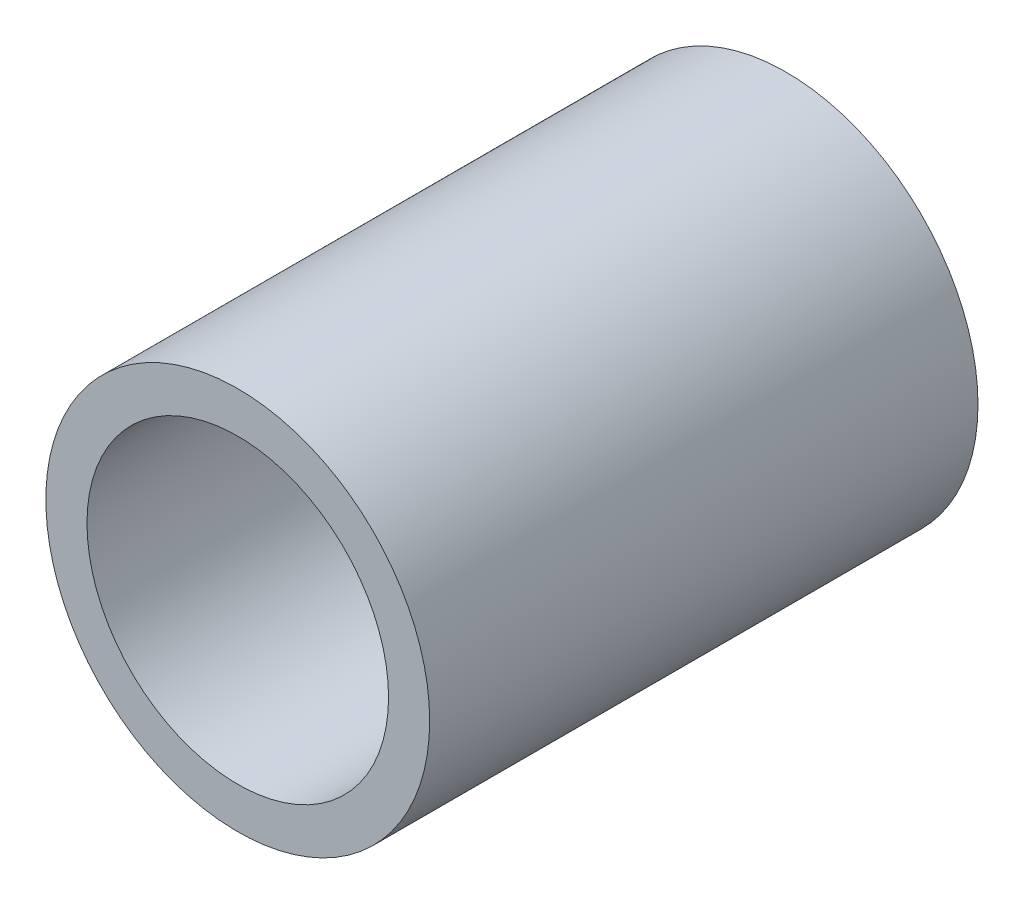
ISO-10303-21;
HEADER;
FILE_DESCRIPTION(('STEP AP214'),'2;1');
FILE_NAME('part.step','',(''),(''),'','','');
FILE_SCHEMA(('AUTOMOTIVE_DESIGN { 1 0 10303 214 1 1 1 1 }'));
ENDSEC;
DATA;
#1=APPLICATION_CONTEXT('core data for automotive mechanical design processes');
#2=APPLICATION_PROTOCOL_DEFINITION('international standard','automotive_design',2000,#1);
#3=PRODUCT_CONTEXT('',#1,'mechanical');
#4=PRODUCT('Part','Part','',(#3));
#5=PRODUCT_RELATED_PRODUCT_CATEGORY('part','',(#4));
#6=PRODUCT_DEFINITION_FORMATION('','',#4);
#7=PRODUCT_DEFINITION_CONTEXT('part definition',#1,'design');
#8=PRODUCT_DEFINITION('design','',#6,#7);
#9=PRODUCT_DEFINITION_SHAPE('','',#8);
#10=(LENGTH_UNIT() NAMED_UNIT(*) SI_UNIT(.MILLI.,.METRE.));
#11=(NAMED_UNIT(*) PLANE_ANGLE_UNIT() SI_UNIT($,.RADIAN.));
#12=(NAMED_UNIT(*) SI_UNIT($,.STERADIAN.) SOLID_ANGLE_UNIT());
#13=UNCERTAINTY_MEASURE_WITH_UNIT(LENGTH_MEASURE(1.E-05),#10,'distance_accuracy_value','');
#14=(GEOMETRIC_REPRESENTATION_CONTEXT(3) GLOBAL_UNCERTAINTY_ASSIGNED_CONTEXT((#13)) GLOBAL_UNIT_ASSIGNED_CONTEXT((#10,
#11,#12)) REPRESENTATION_CONTEXT('',''));
#15=CARTESIAN_POINT('',(0.,0.,0.));
#16=DIRECTION('',(0.,0.,1.));
#17=DIRECTION('',(1.,0.,0.));
#18=AXIS2_PLACEMENT_3D('',#15,#16,#17);
#19=CARTESIAN_POINT('',(0.,0.,80.));
#20=DIRECTION('',(0.,0.,-1.));
#21=DIRECTION('',(-1.,0.,0.));
#22=AXIS2_PLACEMENT_3D('',#19,#20,#21);
#23=CYLINDRICAL_SURFACE('',#22,28.);
#24=CARTESIAN_POINT('',(0.,0.,80.));
#25=DIRECTION('',(0.,0.,1.));
#26=DIRECTION('',(1.,0.,0.));
#27=AXIS2_PLACEMENT_3D('',#24,#25,#26);
#28=CIRCLE('',#27,28.);
#29=CARTESIAN_POINT('',(28.,0.,80.));
#30=VERTEX_POINT('',#29);
#31=EDGE_CURVE('E10',#30,#30,#28,.T.);
#32=ORIENTED_EDGE('',*,*,#31,.F.);
#33=EDGE_LOOP('',(#32));
#34=FACE_BOUND('',#33,.T.);
#35=CARTESIAN_POINT('',(0.,0.,0.));
#36=DIRECTION('',(0.,0.,1.));
#37=DIRECTION('',(1.,0.,0.));
#38=AXIS2_PLACEMENT_3D('',#35,#36,#37);
#39=CIRCLE('',#38,28.);
#40=CARTESIAN_POINT('',(28.,0.,0.));
#41=VERTEX_POINT('',#40);
#42=EDGE_CURVE('E41',#41,#41,#39,.T.);
#43=ORIENTED_EDGE('',*,*,#42,.T.);
#44=EDGE_LOOP('',(#43));
#45=FACE_BOUND('',#44,.T.);
#46=ADVANCED_FACE('F34',(#34,#45),#23,.T.);
#47=CARTESIAN_POINT('',(0.,0.,80.));
#48=DIRECTION('',(0.,0.,1.));
#49=DIRECTION('',(1.,0.,0.));
#50=AXIS2_PLACEMENT_3D('',#47,#48,#49);
#51=PLANE('',#50);
#52=CARTESIAN_POINT('',(0.,0.,80.));
#53=DIRECTION('',(0.,0.,1.));
#54=DIRECTION('',(1.,0.,0.));
#55=AXIS2_PLACEMENT_3D('',#52,#53,#54);
#56=CIRCLE('',#55,22.);
#57=CARTESIAN_POINT('',(22.,0.,80.));
#58=VERTEX_POINT('',#57);
#59=EDGE_CURVE('E47',#58,#58,#56,.T.);
#60=ORIENTED_EDGE('',*,*,#59,.F.);
#61=EDGE_LOOP('',(#60));
#62=FACE_BOUND('',#61,.T.);
#63=ORIENTED_EDGE('',*,*,#31,.T.);
#64=EDGE_LOOP('',(#63));
#65=FACE_BOUND('',#64,.T.);
#66=ADVANCED_FACE('F63',(#62,#65),#51,.T.);
#67=CARTESIAN_POINT('',(0.,0.,0.));
#68=DIRECTION('',(0.,0.,1.));
#69=DIRECTION('',(1.,0.,0.));
#70=AXIS2_PLACEMENT_3D('',#67,#68,#69);
#71=PLANE('',#70);
#72=CARTESIAN_POINT('',(0.,0.,0.));
#73=DIRECTION('',(0.,0.,1.));
#74=DIRECTION('',(1.,0.,0.));
#75=AXIS2_PLACEMENT_3D('',#72,#73,#74);
#76=CIRCLE('',#75,22.);
#77=CARTESIAN_POINT('',(22.,0.,0.));
#78=VERTEX_POINT('',#77);
#79=EDGE_CURVE('E37',#78,#78,#76,.T.);
#80=ORIENTED_EDGE('',*,*,#79,.T.);
#81=EDGE_LOOP('',(#80));
#82=FACE_BOUND('',#81,.T.);
#83=ORIENTED_EDGE('',*,*,#42,.F.);
#84=EDGE_LOOP('',(#83));
#85=FACE_BOUND('',#84,.T.);
#86=ADVANCED_FACE('F54',(#82,#85),#71,.F.);
#87=CARTESIAN_POINT('',(0.,0.,-20.));
#88=DIRECTION('',(0.,0.,1.));
#89=DIRECTION('',(1.,0.,0.));
#90=AXIS2_PLACEMENT_3D('',#87,#88,#89);
#91=CYLINDRICAL_SURFACE('',#90,22.);
#92=ORIENTED_EDGE('',*,*,#59,.T.);
#93=EDGE_LOOP('',(#92));
#94=FACE_BOUND('',#93,.T.);
#95=ORIENTED_EDGE('',*,*,#79,.F.);
#96=EDGE_LOOP('',(#95));
#97=FACE_BOUND('',#96,.T.);
#98=ADVANCED_FACE('F57',(#94,#97),#91,.F.);
#99=CLOSED_SHELL('',(#46,#66,#86,#98));
#100=MANIFOLD_SOLID_BREP('B2',#99);
#101=ADVANCED_BREP_SHAPE_REPRESENTATION('',(#18,#100),#14);
#102=SHAPE_DEFINITION_REPRESENTATION(#9,#101);
ENDSEC;
END-ISO-10303-21;
